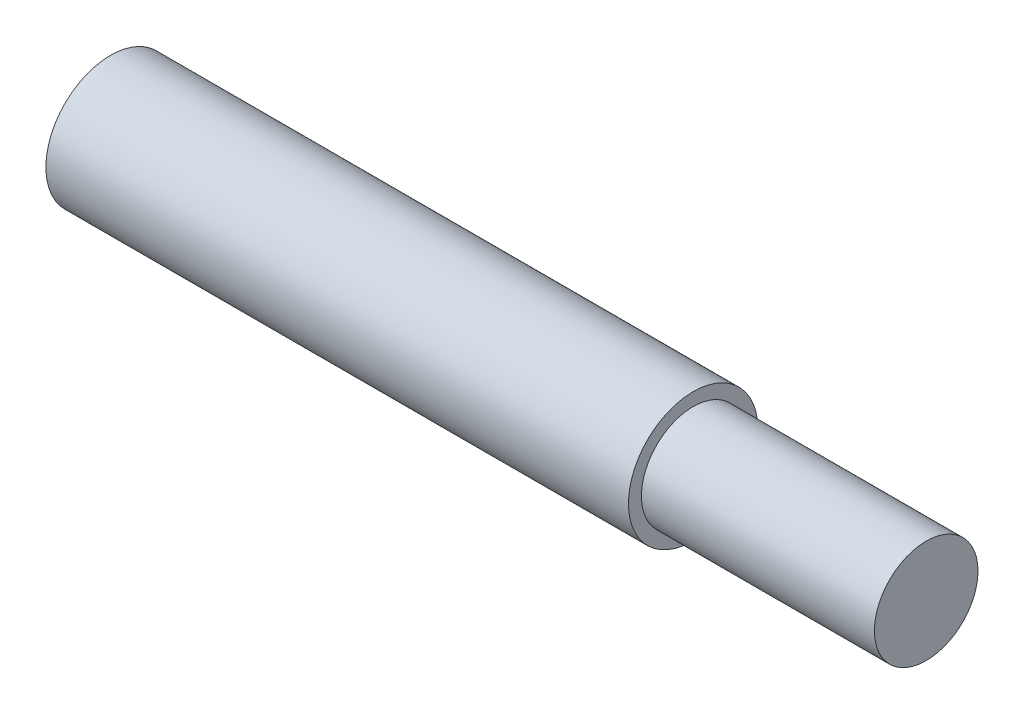
ISO-10303-21;
HEADER;
FILE_DESCRIPTION(('STEP AP214'),'2;1');
FILE_NAME('part.step','',(''),(''),'','','');
FILE_SCHEMA(('AUTOMOTIVE_DESIGN { 1 0 10303 214 1 1 1 1 }'));
ENDSEC;
DATA;
#1=APPLICATION_CONTEXT('core data for automotive mechanical design processes');
#2=APPLICATION_PROTOCOL_DEFINITION('international standard','automotive_design',2000,#1);
#3=PRODUCT_CONTEXT('',#1,'mechanical');
#4=PRODUCT('Part','Part','',(#3));
#5=PRODUCT_RELATED_PRODUCT_CATEGORY('part','',(#4));
#6=PRODUCT_DEFINITION_FORMATION('','',#4);
#7=PRODUCT_DEFINITION_CONTEXT('part definition',#1,'design');
#8=PRODUCT_DEFINITION('design','',#6,#7);
#9=PRODUCT_DEFINITION_SHAPE('','',#8);
#10=(LENGTH_UNIT() NAMED_UNIT(*) SI_UNIT(.MILLI.,.METRE.));
#11=(NAMED_UNIT(*) PLANE_ANGLE_UNIT() SI_UNIT($,.RADIAN.));
#12=(NAMED_UNIT(*) SI_UNIT($,.STERADIAN.) SOLID_ANGLE_UNIT());
#13=UNCERTAINTY_MEASURE_WITH_UNIT(LENGTH_MEASURE(1.E-05),#10,'distance_accuracy_value','');
#14=(GEOMETRIC_REPRESENTATION_CONTEXT(3) GLOBAL_UNCERTAINTY_ASSIGNED_CONTEXT((#13)) GLOBAL_UNIT_ASSIGNED_CONTEXT((#10,
#11,#12)) REPRESENTATION_CONTEXT('',''));
#15=CARTESIAN_POINT('',(0.,0.,0.));
#16=DIRECTION('',(0.,0.,1.));
#17=DIRECTION('',(1.,0.,0.));
#18=AXIS2_PLACEMENT_3D('',#15,#16,#17);
#19=CARTESIAN_POINT('',(11.43,0.,0.));
#20=DIRECTION('',(-1.,0.,0.));
#21=DIRECTION('',(0.,0.,1.));
#22=AXIS2_PLACEMENT_3D('',#19,#20,#21);
#23=CYLINDRICAL_SURFACE('',#22,2.54);
#24=CARTESIAN_POINT('',(11.43,0.,0.));
#25=DIRECTION('',(1.,0.,0.));
#26=DIRECTION('',(0.,0.,-1.));
#27=AXIS2_PLACEMENT_3D('',#24,#25,#26);
#28=CIRCLE('',#27,2.54);
#29=CARTESIAN_POINT('',(11.43,0.,-2.54));
#30=VERTEX_POINT('',#29);
#31=EDGE_CURVE('E10',#30,#30,#28,.T.);
#32=ORIENTED_EDGE('',*,*,#31,.F.);
#33=EDGE_LOOP('',(#32));
#34=FACE_BOUND('',#33,.T.);
#35=CARTESIAN_POINT('',(0.,0.,0.));
#36=DIRECTION('',(1.,0.,0.));
#37=DIRECTION('',(0.,0.,-1.));
#38=AXIS2_PLACEMENT_3D('',#35,#36,#37);
#39=CIRCLE('',#38,2.54);
#40=CARTESIAN_POINT('',(0.,0.,-2.54));
#41=VERTEX_POINT('',#40);
#42=EDGE_CURVE('E36',#41,#41,#39,.T.);
#43=ORIENTED_EDGE('',*,*,#42,.T.);
#44=EDGE_LOOP('',(#43));
#45=FACE_BOUND('',#44,.T.);
#46=ADVANCED_FACE('F33',(#34,#45),#23,.T.);
#47=CARTESIAN_POINT('',(11.43,0.,0.));
#48=DIRECTION('',(1.,0.,0.));
#49=DIRECTION('',(0.,0.,-1.));
#50=AXIS2_PLACEMENT_3D('',#47,#48,#49);
#51=PLANE('',#50);
#52=ORIENTED_EDGE('',*,*,#31,.T.);
#53=EDGE_LOOP('',(#52));
#54=FACE_BOUND('',#53,.T.);
#55=ADVANCED_FACE('F64',(#54),#51,.T.);
#56=CARTESIAN_POINT('',(-28.575,0.,0.));
#57=DIRECTION('',(1.,0.,0.));
#58=DIRECTION('',(0.,0.,-1.));
#59=AXIS2_PLACEMENT_3D('',#56,#57,#58);
#60=CYLINDRICAL_SURFACE('',#59,3.175);
#61=CARTESIAN_POINT('',(-28.575,0.,0.));
#62=DIRECTION('',(1.,0.,0.));
#63=DIRECTION('',(0.,0.,-1.));
#64=AXIS2_PLACEMENT_3D('',#61,#62,#63);
#65=CIRCLE('',#64,3.175);
#66=CARTESIAN_POINT('',(-28.575,0.,-3.175));
#67=VERTEX_POINT('',#66);
#68=EDGE_CURVE('E43',#67,#67,#65,.T.);
#69=ORIENTED_EDGE('',*,*,#68,.T.);
#70=EDGE_LOOP('',(#69));
#71=FACE_BOUND('',#70,.T.);
#72=CARTESIAN_POINT('',(0.,0.,0.));
#73=DIRECTION('',(1.,0.,0.));
#74=DIRECTION('',(0.,0.,-1.));
#75=AXIS2_PLACEMENT_3D('',#72,#73,#74);
#76=CIRCLE('',#75,3.175);
#77=CARTESIAN_POINT('',(0.,0.,-3.175));
#78=VERTEX_POINT('',#77);
#79=EDGE_CURVE('E45',#78,#78,#76,.T.);
#80=ORIENTED_EDGE('',*,*,#79,.F.);
#81=EDGE_LOOP('',(#80));
#82=FACE_BOUND('',#81,.T.);
#83=ADVANCED_FACE('F51',(#71,#82),#60,.T.);
#84=CARTESIAN_POINT('',(-28.575,0.,0.));
#85=DIRECTION('',(1.,0.,0.));
#86=DIRECTION('',(0.,0.,-1.));
#87=AXIS2_PLACEMENT_3D('',#84,#85,#86);
#88=PLANE('',#87);
#89=ORIENTED_EDGE('',*,*,#68,.F.);
#90=EDGE_LOOP('',(#89));
#91=FACE_BOUND('',#90,.T.);
#92=ADVANCED_FACE('F54',(#91),#88,.F.);
#93=CARTESIAN_POINT('',(0.,0.,0.));
#94=DIRECTION('',(1.,0.,0.));
#95=DIRECTION('',(0.,0.,-1.));
#96=AXIS2_PLACEMENT_3D('',#93,#94,#95);
#97=PLANE('',#96);
#98=ORIENTED_EDGE('',*,*,#42,.F.);
#99=EDGE_LOOP('',(#98));
#100=FACE_BOUND('',#99,.T.);
#101=ORIENTED_EDGE('',*,*,#79,.T.);
#102=EDGE_LOOP('',(#101));
#103=FACE_BOUND('',#102,.T.);
#104=ADVANCED_FACE('F56',(#100,#103),#97,.T.);
#105=CLOSED_SHELL('',(#46,#55,#83,#92,#104));
#106=MANIFOLD_SOLID_BREP('B2',#105);
#107=ADVANCED_BREP_SHAPE_REPRESENTATION('',(#18,#106),#14);
#108=SHAPE_DEFINITION_REPRESENTATION(#9,#107);
ENDSEC;
END-ISO-10303-21;
